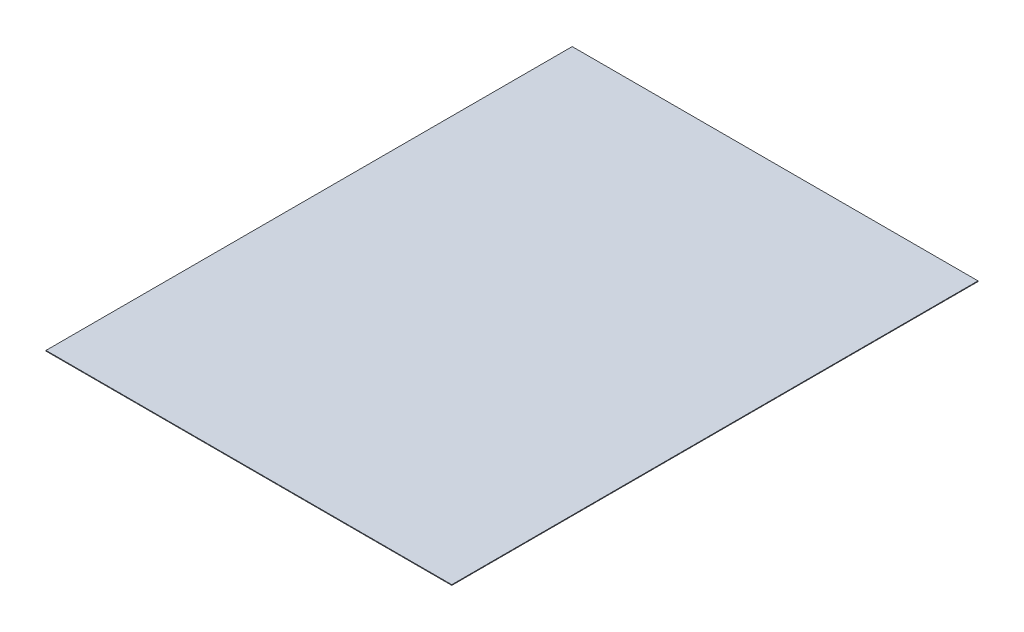
ISO-10303-21;
HEADER;
FILE_DESCRIPTION(('STEP AP214'),'2;1');
FILE_NAME('part.step','',(''),(''),'','','');
FILE_SCHEMA(('AUTOMOTIVE_DESIGN { 1 0 10303 214 1 1 1 1 }'));
ENDSEC;
DATA;
#1=APPLICATION_CONTEXT('core data for automotive mechanical design processes');
#2=APPLICATION_PROTOCOL_DEFINITION('international standard','automotive_design',2000,#1);
#3=PRODUCT_CONTEXT('',#1,'mechanical');
#4=PRODUCT('Part','Part','',(#3));
#5=PRODUCT_RELATED_PRODUCT_CATEGORY('part','',(#4));
#6=PRODUCT_DEFINITION_FORMATION('','',#4);
#7=PRODUCT_DEFINITION_CONTEXT('part definition',#1,'design');
#8=PRODUCT_DEFINITION('design','',#6,#7);
#9=PRODUCT_DEFINITION_SHAPE('','',#8);
#10=(LENGTH_UNIT() NAMED_UNIT(*) SI_UNIT(.MILLI.,.METRE.));
#11=(NAMED_UNIT(*) PLANE_ANGLE_UNIT() SI_UNIT($,.RADIAN.));
#12=(NAMED_UNIT(*) SI_UNIT($,.STERADIAN.) SOLID_ANGLE_UNIT());
#13=UNCERTAINTY_MEASURE_WITH_UNIT(LENGTH_MEASURE(1.E-05),#10,'distance_accuracy_value','');
#14=(GEOMETRIC_REPRESENTATION_CONTEXT(3) GLOBAL_UNCERTAINTY_ASSIGNED_CONTEXT((#13)) GLOBAL_UNIT_ASSIGNED_CONTEXT((#10,
#11,#12)) REPRESENTATION_CONTEXT('',''));
#15=CARTESIAN_POINT('',(0.,0.,0.));
#16=DIRECTION('',(0.,0.,1.));
#17=DIRECTION('',(1.,0.,0.));
#18=AXIS2_PLACEMENT_3D('',#15,#16,#17);
#19=CARTESIAN_POINT('',(42.5,1967.5,-797.5));
#20=DIRECTION('',(-1.,0.,0.));
#21=DIRECTION('',(0.,0.,1.));
#22=AXIS2_PLACEMENT_3D('',#19,#20,#21);
#23=PLANE('',#22);
#24=DIRECTION('',(0.,-1.,0.));
#25=VECTOR('',#24,1.);
#26=CARTESIAN_POINT('',(42.5,1967.5,0.));
#27=LINE('',#26,#25);
#28=CARTESIAN_POINT('',(42.5,1968.5,0.));
#29=VERTEX_POINT('',#28);
#30=CARTESIAN_POINT('',(42.5,1967.5,0.));
#31=VERTEX_POINT('',#30);
#32=EDGE_CURVE('E103',#29,#31,#27,.T.);
#33=ORIENTED_EDGE('',*,*,#32,.F.);
#34=DIRECTION('',(0.,0.,1.));
#35=VECTOR('',#34,1.);
#36=CARTESIAN_POINT('',(42.5,1968.5,-797.5));
#37=LINE('',#36,#35);
#38=CARTESIAN_POINT('',(42.5,1968.5,-797.5));
#39=VERTEX_POINT('',#38);
#40=EDGE_CURVE('E11',#39,#29,#37,.T.);
#41=ORIENTED_EDGE('',*,*,#40,.F.);
#42=DIRECTION('',(0.,-1.,0.));
#43=VECTOR('',#42,1.);
#44=CARTESIAN_POINT('',(42.5,1967.5,-797.5));
#45=LINE('',#44,#43);
#46=CARTESIAN_POINT('',(42.5,1967.5,-797.5));
#47=VERTEX_POINT('',#46);
#48=EDGE_CURVE('E97',#39,#47,#45,.T.);
#49=ORIENTED_EDGE('',*,*,#48,.T.);
#50=DIRECTION('',(0.,0.,1.));
#51=VECTOR('',#50,1.);
#52=CARTESIAN_POINT('',(42.5,1967.5,-797.5));
#53=LINE('',#52,#51);
#54=EDGE_CURVE('E42',#47,#31,#53,.T.);
#55=ORIENTED_EDGE('',*,*,#54,.T.);
#56=EDGE_LOOP('',(#33,#41,#49,#55));
#57=FACE_BOUND('',#56,.T.);
#58=ADVANCED_FACE('F39',(#57),#23,.T.);
#59=CARTESIAN_POINT('',(42.5,1968.5,-797.5));
#60=DIRECTION('',(0.,1.,0.));
#61=DIRECTION('',(0.,0.,1.));
#62=AXIS2_PLACEMENT_3D('',#59,#60,#61);
#63=PLANE('',#62);
#64=DIRECTION('',(-1.,0.,0.));
#65=VECTOR('',#64,1.);
#66=CARTESIAN_POINT('',(42.5,1968.5,0.));
#67=LINE('',#66,#65);
#68=CARTESIAN_POINT('',(657.5,1968.5,0.));
#69=VERTEX_POINT('',#68);
#70=EDGE_CURVE('E99',#69,#29,#67,.T.);
#71=ORIENTED_EDGE('',*,*,#70,.F.);
#72=DIRECTION('',(0.,0.,1.));
#73=VECTOR('',#72,1.);
#74=CARTESIAN_POINT('',(657.5,1968.5,-797.5));
#75=LINE('',#74,#73);
#76=CARTESIAN_POINT('',(657.5,1968.5,-797.5));
#77=VERTEX_POINT('',#76);
#78=EDGE_CURVE('E48',#77,#69,#75,.T.);
#79=ORIENTED_EDGE('',*,*,#78,.F.);
#80=DIRECTION('',(-1.,0.,0.));
#81=VECTOR('',#80,1.);
#82=CARTESIAN_POINT('',(42.5,1968.5,-797.5));
#83=LINE('',#82,#81);
#84=EDGE_CURVE('E94',#77,#39,#83,.T.);
#85=ORIENTED_EDGE('',*,*,#84,.T.);
#86=ORIENTED_EDGE('',*,*,#40,.T.);
#87=EDGE_LOOP('',(#71,#79,#85,#86));
#88=FACE_BOUND('',#87,.T.);
#89=ADVANCED_FACE('F113',(#88),#63,.T.);
#90=CARTESIAN_POINT('',(657.5,1967.5,-797.5));
#91=DIRECTION('',(1.,0.,0.));
#92=DIRECTION('',(0.,0.,-1.));
#93=AXIS2_PLACEMENT_3D('',#90,#91,#92);
#94=PLANE('',#93);
#95=DIRECTION('',(0.,1.,0.));
#96=VECTOR('',#95,1.);
#97=CARTESIAN_POINT('',(657.5,1967.5,0.));
#98=LINE('',#97,#96);
#99=CARTESIAN_POINT('',(657.5,1967.5,0.));
#100=VERTEX_POINT('',#99);
#101=EDGE_CURVE('E89',#100,#69,#98,.T.);
#102=ORIENTED_EDGE('',*,*,#101,.F.);
#103=DIRECTION('',(0.,0.,1.));
#104=VECTOR('',#103,1.);
#105=CARTESIAN_POINT('',(657.5,1967.5,-797.5));
#106=LINE('',#105,#104);
#107=CARTESIAN_POINT('',(657.5,1967.5,-797.5));
#108=VERTEX_POINT('',#107);
#109=EDGE_CURVE('E84',#108,#100,#106,.T.);
#110=ORIENTED_EDGE('',*,*,#109,.F.);
#111=DIRECTION('',(0.,1.,0.));
#112=VECTOR('',#111,1.);
#113=CARTESIAN_POINT('',(657.5,1967.5,-797.5));
#114=LINE('',#113,#112);
#115=EDGE_CURVE('E87',#108,#77,#114,.T.);
#116=ORIENTED_EDGE('',*,*,#115,.T.);
#117=ORIENTED_EDGE('',*,*,#78,.T.);
#118=EDGE_LOOP('',(#102,#110,#116,#117));
#119=FACE_BOUND('',#118,.T.);
#120=ADVANCED_FACE('F86',(#119),#94,.T.);
#121=CARTESIAN_POINT('',(42.5,1967.5,-797.5));
#122=DIRECTION('',(0.,-1.,0.));
#123=DIRECTION('',(0.,0.,-1.));
#124=AXIS2_PLACEMENT_3D('',#121,#122,#123);
#125=PLANE('',#124);
#126=DIRECTION('',(1.,0.,0.));
#127=VECTOR('',#126,1.);
#128=CARTESIAN_POINT('',(42.5,1967.5,0.));
#129=LINE('',#128,#127);
#130=EDGE_CURVE('E106',#31,#100,#129,.T.);
#131=ORIENTED_EDGE('',*,*,#130,.F.);
#132=ORIENTED_EDGE('',*,*,#54,.F.);
#133=DIRECTION('',(1.,0.,0.));
#134=VECTOR('',#133,1.);
#135=CARTESIAN_POINT('',(42.5,1967.5,-797.5));
#136=LINE('',#135,#134);
#137=EDGE_CURVE('E93',#47,#108,#136,.T.);
#138=ORIENTED_EDGE('',*,*,#137,.T.);
#139=ORIENTED_EDGE('',*,*,#109,.T.);
#140=EDGE_LOOP('',(#131,#132,#138,#139));
#141=FACE_BOUND('',#140,.T.);
#142=ADVANCED_FACE('F96',(#141),#125,.T.);
#143=CARTESIAN_POINT('',(0.,0.,-797.5));
#144=DIRECTION('',(0.,0.,-1.));
#145=DIRECTION('',(-1.,0.,0.));
#146=AXIS2_PLACEMENT_3D('',#143,#144,#145);
#147=PLANE('',#146);
#148=ORIENTED_EDGE('',*,*,#48,.F.);
#149=ORIENTED_EDGE('',*,*,#84,.F.);
#150=ORIENTED_EDGE('',*,*,#115,.F.);
#151=ORIENTED_EDGE('',*,*,#137,.F.);
#152=EDGE_LOOP('',(#148,#149,#150,#151));
#153=FACE_BOUND('',#152,.T.);
#154=ADVANCED_FACE('F92',(#153),#147,.T.);
#155=CARTESIAN_POINT('',(0.,0.,0.));
#156=DIRECTION('',(0.,0.,-1.));
#157=DIRECTION('',(-1.,0.,0.));
#158=AXIS2_PLACEMENT_3D('',#155,#156,#157);
#159=PLANE('',#158);
#160=ORIENTED_EDGE('',*,*,#32,.T.);
#161=ORIENTED_EDGE('',*,*,#130,.T.);
#162=ORIENTED_EDGE('',*,*,#101,.T.);
#163=ORIENTED_EDGE('',*,*,#70,.T.);
#164=EDGE_LOOP('',(#160,#161,#162,#163));
#165=FACE_BOUND('',#164,.T.);
#166=ADVANCED_FACE('F112',(#165),#159,.F.);
#167=CLOSED_SHELL('',(#58,#89,#120,#142,#154,#166));
#168=MANIFOLD_SOLID_BREP('B2',#167);
#169=ADVANCED_BREP_SHAPE_REPRESENTATION('',(#18,#168),#14);
#170=SHAPE_DEFINITION_REPRESENTATION(#9,#169);
ENDSEC;
END-ISO-10303-21;
